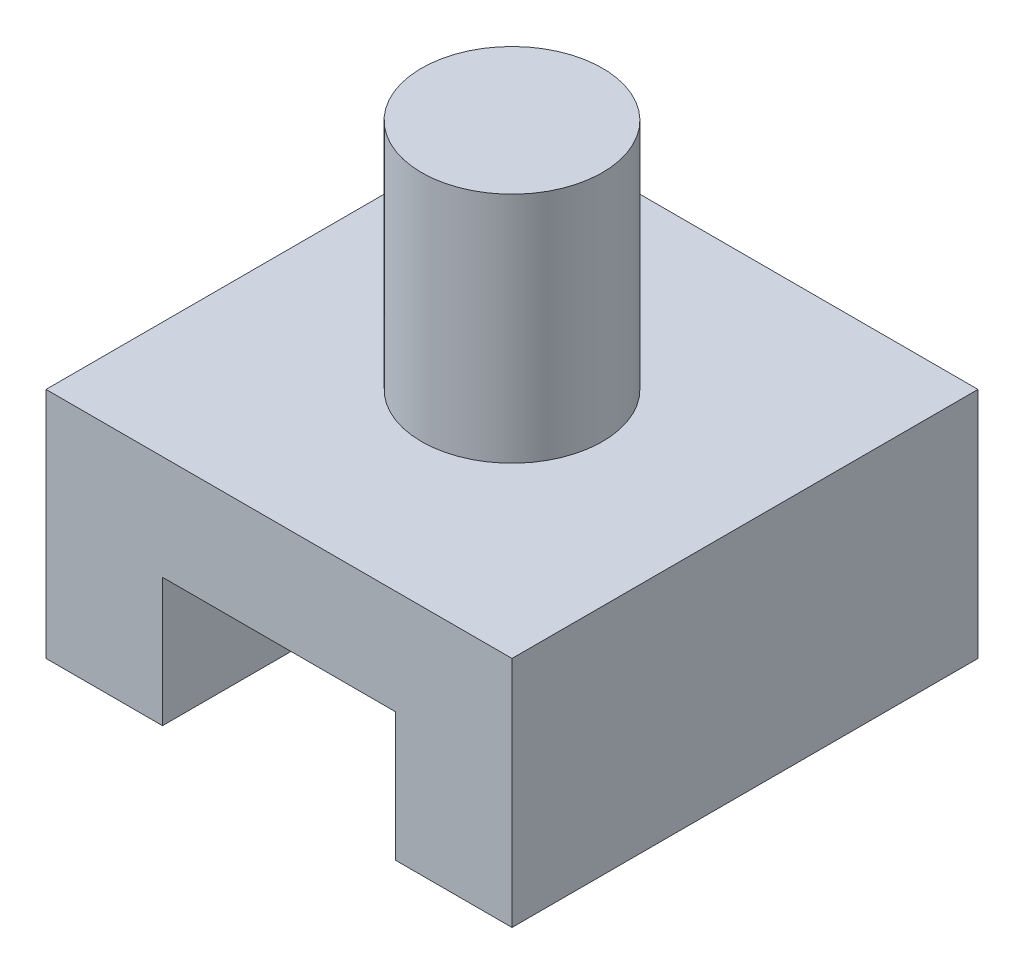
ISO-10303-21;
HEADER;
FILE_DESCRIPTION(('STEP AP214'),'2;1');
FILE_NAME('part.step','',(''),(''),'','','');
FILE_SCHEMA(('AUTOMOTIVE_DESIGN { 1 0 10303 214 1 1 1 1 }'));
ENDSEC;
DATA;
#1=APPLICATION_CONTEXT('core data for automotive mechanical design processes');
#2=APPLICATION_PROTOCOL_DEFINITION('international standard','automotive_design',2000,#1);
#3=PRODUCT_CONTEXT('',#1,'mechanical');
#4=PRODUCT('Part','Part','',(#3));
#5=PRODUCT_RELATED_PRODUCT_CATEGORY('part','',(#4));
#6=PRODUCT_DEFINITION_FORMATION('','',#4);
#7=PRODUCT_DEFINITION_CONTEXT('part definition',#1,'design');
#8=PRODUCT_DEFINITION('design','',#6,#7);
#9=PRODUCT_DEFINITION_SHAPE('','',#8);
#10=(LENGTH_UNIT() NAMED_UNIT(*) SI_UNIT(.MILLI.,.METRE.));
#11=(NAMED_UNIT(*) PLANE_ANGLE_UNIT() SI_UNIT($,.RADIAN.));
#12=(NAMED_UNIT(*) SI_UNIT($,.STERADIAN.) SOLID_ANGLE_UNIT());
#13=UNCERTAINTY_MEASURE_WITH_UNIT(LENGTH_MEASURE(1.E-05),#10,'distance_accuracy_value','');
#14=(GEOMETRIC_REPRESENTATION_CONTEXT(3) GLOBAL_UNCERTAINTY_ASSIGNED_CONTEXT((#13)) GLOBAL_UNIT_ASSIGNED_CONTEXT((#10,
#11,#12)) REPRESENTATION_CONTEXT('',''));
#15=CARTESIAN_POINT('',(0.,0.,0.));
#16=DIRECTION('',(0.,0.,1.));
#17=DIRECTION('',(1.,0.,0.));
#18=AXIS2_PLACEMENT_3D('',#15,#16,#17);
#19=CARTESIAN_POINT('',(0.,0.,0.));
#20=DIRECTION('',(0.,-1.,0.));
#21=DIRECTION('',(0.,0.,-1.));
#22=AXIS2_PLACEMENT_3D('',#19,#20,#21);
#23=PLANE('',#22);
#24=DIRECTION('',(0.,0.,1.));
#25=VECTOR('',#24,1.);
#26=CARTESIAN_POINT('',(-30.,0.,-40.));
#27=LINE('',#26,#25);
#28=CARTESIAN_POINT('',(-30.,0.,-40.));
#29=VERTEX_POINT('',#28);
#30=CARTESIAN_POINT('',(-30.,0.,0.));
#31=VERTEX_POINT('',#30);
#32=EDGE_CURVE('E141',#29,#31,#27,.T.);
#33=ORIENTED_EDGE('',*,*,#32,.T.);
#34=DIRECTION('',(1.,0.,0.));
#35=VECTOR('',#34,1.);
#36=CARTESIAN_POINT('',(0.,0.,0.));
#37=LINE('',#36,#35);
#38=CARTESIAN_POINT('',(-40.,0.,0.));
#39=VERTEX_POINT('',#38);
#40=EDGE_CURVE('E149',#39,#31,#37,.T.);
#41=ORIENTED_EDGE('',*,*,#40,.F.);
#42=DIRECTION('',(0.,0.,1.));
#43=VECTOR('',#42,1.);
#44=CARTESIAN_POINT('',(-40.,0.,0.));
#45=LINE('',#44,#43);
#46=CARTESIAN_POINT('',(-40.,0.,-40.));
#47=VERTEX_POINT('',#46);
#48=EDGE_CURVE('E159',#47,#39,#45,.T.);
#49=ORIENTED_EDGE('',*,*,#48,.F.);
#50=DIRECTION('',(-1.,0.,0.));
#51=VECTOR('',#50,1.);
#52=CARTESIAN_POINT('',(-40.,0.,-40.));
#53=LINE('',#52,#51);
#54=EDGE_CURVE('E157',#29,#47,#53,.T.);
#55=ORIENTED_EDGE('',*,*,#54,.F.);
#56=EDGE_LOOP('',(#33,#41,#49,#55));
#57=FACE_BOUND('',#56,.T.);
#58=ADVANCED_FACE('F37',(#57),#23,.T.);
#59=CARTESIAN_POINT('',(0.,20.,-40.));
#60=DIRECTION('',(-1.,0.,0.));
#61=DIRECTION('',(0.,0.,1.));
#62=AXIS2_PLACEMENT_3D('',#59,#60,#61);
#63=PLANE('',#62);
#64=DIRECTION('',(0.,0.,-1.));
#65=VECTOR('',#64,1.);
#66=CARTESIAN_POINT('',(0.,0.,-40.));
#67=LINE('',#66,#65);
#68=CARTESIAN_POINT('',(0.,0.,0.));
#69=VERTEX_POINT('',#68);
#70=CARTESIAN_POINT('',(0.,0.,-40.));
#71=VERTEX_POINT('',#70);
#72=EDGE_CURVE('E144',#69,#71,#67,.T.);
#73=ORIENTED_EDGE('',*,*,#72,.T.);
#74=DIRECTION('',(0.,-1.,0.));
#75=VECTOR('',#74,1.);
#76=CARTESIAN_POINT('',(0.,20.,-40.));
#77=LINE('',#76,#75);
#78=CARTESIAN_POINT('',(0.,20.,-40.));
#79=VERTEX_POINT('',#78);
#80=EDGE_CURVE('E41',#79,#71,#77,.T.);
#81=ORIENTED_EDGE('',*,*,#80,.F.);
#82=DIRECTION('',(0.,0.,-1.));
#83=VECTOR('',#82,1.);
#84=CARTESIAN_POINT('',(0.,20.,-40.));
#85=LINE('',#84,#83);
#86=CARTESIAN_POINT('',(0.,20.,0.));
#87=VERTEX_POINT('',#86);
#88=EDGE_CURVE('E147',#87,#79,#85,.T.);
#89=ORIENTED_EDGE('',*,*,#88,.F.);
#90=DIRECTION('',(0.,-1.,0.));
#91=VECTOR('',#90,1.);
#92=CARTESIAN_POINT('',(0.,20.,0.));
#93=LINE('',#92,#91);
#94=EDGE_CURVE('E154',#87,#69,#93,.T.);
#95=ORIENTED_EDGE('',*,*,#94,.T.);
#96=EDGE_LOOP('',(#73,#81,#89,#95));
#97=FACE_BOUND('',#96,.T.);
#98=ADVANCED_FACE('F39',(#97),#63,.F.);
#99=CARTESIAN_POINT('',(-40.,20.,-40.));
#100=DIRECTION('',(0.,0.,1.));
#101=DIRECTION('',(1.,0.,0.));
#102=AXIS2_PLACEMENT_3D('',#99,#100,#101);
#103=PLANE('',#102);
#104=DIRECTION('',(-1.,0.,0.));
#105=VECTOR('',#104,1.);
#106=CARTESIAN_POINT('',(-30.,11.0354367785299,-40.));
#107=LINE('',#106,#105);
#108=CARTESIAN_POINT('',(-10.,11.0354367785299,-40.));
#109=VERTEX_POINT('',#108);
#110=CARTESIAN_POINT('',(-30.,11.0354367785299,-40.));
#111=VERTEX_POINT('',#110);
#112=EDGE_CURVE('E122',#109,#111,#107,.T.);
#113=ORIENTED_EDGE('',*,*,#112,.T.);
#114=DIRECTION('',(0.,-1.,0.));
#115=VECTOR('',#114,1.);
#116=CARTESIAN_POINT('',(-30.,0.,-40.));
#117=LINE('',#116,#115);
#118=EDGE_CURVE('E126',#111,#29,#117,.T.);
#119=ORIENTED_EDGE('',*,*,#118,.T.);
#120=ORIENTED_EDGE('',*,*,#54,.T.);
#121=DIRECTION('',(0.,-1.,0.));
#122=VECTOR('',#121,1.);
#123=CARTESIAN_POINT('',(-40.,20.,-40.));
#124=LINE('',#123,#122);
#125=CARTESIAN_POINT('',(-40.,20.,-40.));
#126=VERTEX_POINT('',#125);
#127=EDGE_CURVE('E166',#126,#47,#124,.T.);
#128=ORIENTED_EDGE('',*,*,#127,.F.);
#129=DIRECTION('',(-1.,0.,0.));
#130=VECTOR('',#129,1.);
#131=CARTESIAN_POINT('',(-40.,20.,-40.));
#132=LINE('',#131,#130);
#133=EDGE_CURVE('E91',#79,#126,#132,.T.);
#134=ORIENTED_EDGE('',*,*,#133,.F.);
#135=ORIENTED_EDGE('',*,*,#80,.T.);
#136=CARTESIAN_POINT('',(-10.,0.,-40.));
#137=VERTEX_POINT('',#136);
#138=EDGE_CURVE('E130',#71,#137,#53,.T.);
#139=ORIENTED_EDGE('',*,*,#138,.T.);
#140=DIRECTION('',(0.,1.,0.));
#141=VECTOR('',#140,1.);
#142=CARTESIAN_POINT('',(-10.,11.0354367785299,-40.));
#143=LINE('',#142,#141);
#144=EDGE_CURVE('E53',#137,#109,#143,.T.);
#145=ORIENTED_EDGE('',*,*,#144,.T.);
#146=EDGE_LOOP('',(#113,#119,#120,#128,#134,#135,#139,#145));
#147=FACE_BOUND('',#146,.T.);
#148=ADVANCED_FACE('F129',(#147),#103,.F.);
#149=CARTESIAN_POINT('',(-40.,20.,0.));
#150=DIRECTION('',(1.,0.,0.));
#151=DIRECTION('',(0.,0.,-1.));
#152=AXIS2_PLACEMENT_3D('',#149,#150,#151);
#153=PLANE('',#152);
#154=ORIENTED_EDGE('',*,*,#48,.T.);
#155=DIRECTION('',(0.,-1.,0.));
#156=VECTOR('',#155,1.);
#157=CARTESIAN_POINT('',(-40.,20.,0.));
#158=LINE('',#157,#156);
#159=CARTESIAN_POINT('',(-40.,20.,0.));
#160=VERTEX_POINT('',#159);
#161=EDGE_CURVE('E164',#160,#39,#158,.T.);
#162=ORIENTED_EDGE('',*,*,#161,.F.);
#163=DIRECTION('',(0.,0.,1.));
#164=VECTOR('',#163,1.);
#165=CARTESIAN_POINT('',(-40.,20.,0.));
#166=LINE('',#165,#164);
#167=EDGE_CURVE('E151',#126,#160,#166,.T.);
#168=ORIENTED_EDGE('',*,*,#167,.F.);
#169=ORIENTED_EDGE('',*,*,#127,.T.);
#170=EDGE_LOOP('',(#154,#162,#168,#169));
#171=FACE_BOUND('',#170,.T.);
#172=ADVANCED_FACE('F185',(#171),#153,.F.);
#173=CARTESIAN_POINT('',(0.,20.,0.));
#174=DIRECTION('',(0.,0.,-1.));
#175=DIRECTION('',(-1.,0.,0.));
#176=AXIS2_PLACEMENT_3D('',#173,#174,#175);
#177=PLANE('',#176);
#178=ORIENTED_EDGE('',*,*,#40,.T.);
#179=DIRECTION('',(0.,-1.,0.));
#180=VECTOR('',#179,1.);
#181=CARTESIAN_POINT('',(-30.,0.,0.));
#182=LINE('',#181,#180);
#183=CARTESIAN_POINT('',(-30.,11.0354367785299,0.));
#184=VERTEX_POINT('',#183);
#185=EDGE_CURVE('E131',#184,#31,#182,.T.);
#186=ORIENTED_EDGE('',*,*,#185,.F.);
#187=DIRECTION('',(-1.,0.,0.));
#188=VECTOR('',#187,1.);
#189=CARTESIAN_POINT('',(-30.,11.0354367785299,0.));
#190=LINE('',#189,#188);
#191=CARTESIAN_POINT('',(-10.,11.0354367785299,0.));
#192=VERTEX_POINT('',#191);
#193=EDGE_CURVE('E133',#192,#184,#190,.T.);
#194=ORIENTED_EDGE('',*,*,#193,.F.);
#195=DIRECTION('',(0.,1.,0.));
#196=VECTOR('',#195,1.);
#197=CARTESIAN_POINT('',(-10.,11.0354367785299,0.));
#198=LINE('',#197,#196);
#199=CARTESIAN_POINT('',(-10.,0.,0.));
#200=VERTEX_POINT('',#199);
#201=EDGE_CURVE('E114',#200,#192,#198,.T.);
#202=ORIENTED_EDGE('',*,*,#201,.F.);
#203=EDGE_CURVE('E83',#200,#69,#37,.T.);
#204=ORIENTED_EDGE('',*,*,#203,.T.);
#205=ORIENTED_EDGE('',*,*,#94,.F.);
#206=DIRECTION('',(1.,0.,0.));
#207=VECTOR('',#206,1.);
#208=CARTESIAN_POINT('',(0.,20.,0.));
#209=LINE('',#208,#207);
#210=EDGE_CURVE('E62',#160,#87,#209,.T.);
#211=ORIENTED_EDGE('',*,*,#210,.F.);
#212=ORIENTED_EDGE('',*,*,#161,.T.);
#213=EDGE_LOOP('',(#178,#186,#194,#202,#204,#205,#211,#212));
#214=FACE_BOUND('',#213,.T.);
#215=ADVANCED_FACE('F177',(#214),#177,.F.);
#216=CARTESIAN_POINT('',(0.,20.,0.));
#217=DIRECTION('',(0.,-1.,0.));
#218=DIRECTION('',(0.,0.,-1.));
#219=AXIS2_PLACEMENT_3D('',#216,#217,#218);
#220=PLANE('',#219);
#221=CARTESIAN_POINT('',(-20.,20.,-20.));
#222=DIRECTION('',(0.,1.,0.));
#223=DIRECTION('',(0.,0.,1.));
#224=AXIS2_PLACEMENT_3D('',#221,#222,#223);
#225=CIRCLE('',#224,7.76528748986459);
#226=CARTESIAN_POINT('',(-20.,20.,-12.2347125101354));
#227=VERTEX_POINT('',#226);
#228=EDGE_CURVE('E11',#227,#227,#225,.T.);
#229=ORIENTED_EDGE('',*,*,#228,.F.);
#230=EDGE_LOOP('',(#229));
#231=FACE_BOUND('',#230,.T.);
#232=ORIENTED_EDGE('',*,*,#88,.T.);
#233=ORIENTED_EDGE('',*,*,#133,.T.);
#234=ORIENTED_EDGE('',*,*,#167,.T.);
#235=ORIENTED_EDGE('',*,*,#210,.T.);
#236=EDGE_LOOP('',(#232,#233,#234,#235));
#237=FACE_BOUND('',#236,.T.);
#238=ADVANCED_FACE('F186',(#231,#237),#220,.F.);
#239=DIRECTION('',(0.,0.,1.));
#240=VECTOR('',#239,1.);
#241=CARTESIAN_POINT('',(-10.,0.,-40.));
#242=LINE('',#241,#240);
#243=EDGE_CURVE('E119',#137,#200,#242,.T.);
#244=ORIENTED_EDGE('',*,*,#243,.F.);
#245=ORIENTED_EDGE('',*,*,#138,.F.);
#246=ORIENTED_EDGE('',*,*,#72,.F.);
#247=ORIENTED_EDGE('',*,*,#203,.F.);
#248=EDGE_LOOP('',(#244,#245,#246,#247));
#249=FACE_BOUND('',#248,.T.);
#250=ADVANCED_FACE('F176',(#249),#23,.T.);
#251=CARTESIAN_POINT('',(-30.,0.,-40.));
#252=DIRECTION('',(-1.,0.,0.));
#253=DIRECTION('',(0.,0.,1.));
#254=AXIS2_PLACEMENT_3D('',#251,#252,#253);
#255=PLANE('',#254);
#256=ORIENTED_EDGE('',*,*,#185,.T.);
#257=ORIENTED_EDGE('',*,*,#32,.F.);
#258=ORIENTED_EDGE('',*,*,#118,.F.);
#259=DIRECTION('',(0.,0.,1.));
#260=VECTOR('',#259,1.);
#261=CARTESIAN_POINT('',(-30.,11.0354367785299,-40.));
#262=LINE('',#261,#260);
#263=EDGE_CURVE('E118',#111,#184,#262,.T.);
#264=ORIENTED_EDGE('',*,*,#263,.T.);
#265=EDGE_LOOP('',(#256,#257,#258,#264));
#266=FACE_BOUND('',#265,.T.);
#267=ADVANCED_FACE('F181',(#266),#255,.F.);
#268=CARTESIAN_POINT('',(-30.,11.0354367785299,-40.));
#269=DIRECTION('',(0.,1.,0.));
#270=DIRECTION('',(0.,0.,1.));
#271=AXIS2_PLACEMENT_3D('',#268,#269,#270);
#272=PLANE('',#271);
#273=ORIENTED_EDGE('',*,*,#193,.T.);
#274=ORIENTED_EDGE('',*,*,#263,.F.);
#275=ORIENTED_EDGE('',*,*,#112,.F.);
#276=DIRECTION('',(0.,0.,1.));
#277=VECTOR('',#276,1.);
#278=CARTESIAN_POINT('',(-10.,11.0354367785299,-40.));
#279=LINE('',#278,#277);
#280=EDGE_CURVE('E111',#109,#192,#279,.T.);
#281=ORIENTED_EDGE('',*,*,#280,.T.);
#282=EDGE_LOOP('',(#273,#274,#275,#281));
#283=FACE_BOUND('',#282,.T.);
#284=ADVANCED_FACE('F123',(#283),#272,.F.);
#285=CARTESIAN_POINT('',(-10.,11.0354367785299,-40.));
#286=DIRECTION('',(1.,0.,0.));
#287=DIRECTION('',(0.,1.,0.));
#288=AXIS2_PLACEMENT_3D('',#285,#286,#287);
#289=PLANE('',#288);
#290=ORIENTED_EDGE('',*,*,#201,.T.);
#291=ORIENTED_EDGE('',*,*,#280,.F.);
#292=ORIENTED_EDGE('',*,*,#144,.F.);
#293=ORIENTED_EDGE('',*,*,#243,.T.);
#294=EDGE_LOOP('',(#290,#291,#292,#293));
#295=FACE_BOUND('',#294,.T.);
#296=ADVANCED_FACE('F113',(#295),#289,.F.);
#297=CARTESIAN_POINT('',(-20.,40.,-20.));
#298=DIRECTION('',(0.,-1.,0.));
#299=DIRECTION('',(0.,0.,-1.));
#300=AXIS2_PLACEMENT_3D('',#297,#298,#299);
#301=CYLINDRICAL_SURFACE('',#300,7.76528748986459);
#302=CARTESIAN_POINT('',(-20.,40.,-20.));
#303=DIRECTION('',(0.,1.,0.));
#304=DIRECTION('',(0.,0.,1.));
#305=AXIS2_PLACEMENT_3D('',#302,#303,#304);
#306=CIRCLE('',#305,7.76528748986459);
#307=CARTESIAN_POINT('',(-20.,40.,-12.2347125101354));
#308=VERTEX_POINT('',#307);
#309=EDGE_CURVE('E139',#308,#308,#306,.T.);
#310=ORIENTED_EDGE('',*,*,#309,.F.);
#311=EDGE_LOOP('',(#310));
#312=FACE_BOUND('',#311,.T.);
#313=ORIENTED_EDGE('',*,*,#228,.T.);
#314=EDGE_LOOP('',(#313));
#315=FACE_BOUND('',#314,.T.);
#316=ADVANCED_FACE('F253',(#312,#315),#301,.T.);
#317=CARTESIAN_POINT('',(-20.,40.,-20.));
#318=DIRECTION('',(0.,1.,0.));
#319=DIRECTION('',(0.,0.,1.));
#320=AXIS2_PLACEMENT_3D('',#317,#318,#319);
#321=PLANE('',#320);
#322=ORIENTED_EDGE('',*,*,#309,.T.);
#323=EDGE_LOOP('',(#322));
#324=FACE_BOUND('',#323,.T.);
#325=ADVANCED_FACE('F267',(#324),#321,.T.);
#326=CLOSED_SHELL('',(#58,#98,#148,#172,#215,#238,#250,#267,#284,#296,#316,#325));
#327=MANIFOLD_SOLID_BREP('B2',#326);
#328=ADVANCED_BREP_SHAPE_REPRESENTATION('',(#18,#327),#14);
#329=SHAPE_DEFINITION_REPRESENTATION(#9,#328);
ENDSEC;
END-ISO-10303-21;
